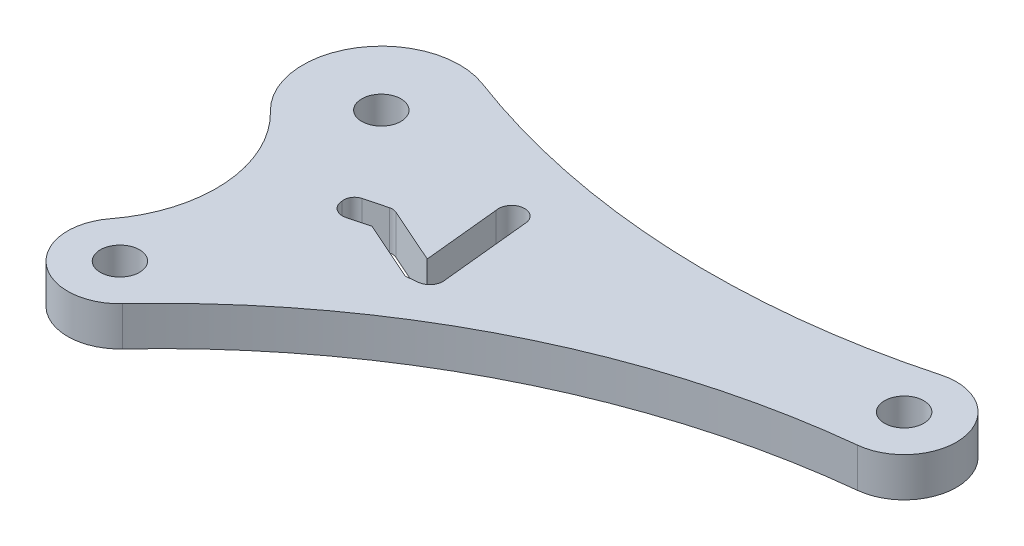
ISO-10303-21;
HEADER;
FILE_DESCRIPTION(('STEP AP214'),'2;1');
FILE_NAME('part.step','',(''),(''),'','','');
FILE_SCHEMA(('AUTOMOTIVE_DESIGN { 1 0 10303 214 1 1 1 1 }'));
ENDSEC;
DATA;
#1=APPLICATION_CONTEXT('core data for automotive mechanical design processes');
#2=APPLICATION_PROTOCOL_DEFINITION('international standard','automotive_design',2000,#1);
#3=PRODUCT_CONTEXT('',#1,'mechanical');
#4=PRODUCT('Part','Part','',(#3));
#5=PRODUCT_RELATED_PRODUCT_CATEGORY('part','',(#4));
#6=PRODUCT_DEFINITION_FORMATION('','',#4);
#7=PRODUCT_DEFINITION_CONTEXT('part definition',#1,'design');
#8=PRODUCT_DEFINITION('design','',#6,#7);
#9=PRODUCT_DEFINITION_SHAPE('','',#8);
#10=(LENGTH_UNIT() NAMED_UNIT(*) SI_UNIT(.MILLI.,.METRE.));
#11=(NAMED_UNIT(*) PLANE_ANGLE_UNIT() SI_UNIT($,.RADIAN.));
#12=(NAMED_UNIT(*) SI_UNIT($,.STERADIAN.) SOLID_ANGLE_UNIT());
#13=UNCERTAINTY_MEASURE_WITH_UNIT(LENGTH_MEASURE(1.E-05),#10,'distance_accuracy_value','');
#14=(GEOMETRIC_REPRESENTATION_CONTEXT(3) GLOBAL_UNCERTAINTY_ASSIGNED_CONTEXT((#13)) GLOBAL_UNIT_ASSIGNED_CONTEXT((#10,
#11,#12)) REPRESENTATION_CONTEXT('',''));
#15=CARTESIAN_POINT('',(0.,0.,0.));
#16=DIRECTION('',(0.,0.,1.));
#17=DIRECTION('',(1.,0.,0.));
#18=AXIS2_PLACEMENT_3D('',#15,#16,#17);
#19=CARTESIAN_POINT('',(41754.3113132953,-442.439495490848,-69.2692277752465));
#20=DIRECTION('',(0.,-1.,0.));
#21=DIRECTION('',(-1.,0.,0.));
#22=AXIS2_PLACEMENT_3D('',#19,#20,#21);
#23=CYLINDRICAL_SURFACE('',#22,59.9999999996444);
#24=CARTESIAN_POINT('',(41754.3113132953,-445.439495490848,-69.2692277752465));
#25=DIRECTION('',(0.,1.,0.));
#26=DIRECTION('',(1.,0.,0.));
#27=AXIS2_PLACEMENT_3D('',#24,#25,#26);
#28=CIRCLE('',#27,59.9999999996444);
#29=CARTESIAN_POINT('',(41733.1749496589,-445.439495490847,-13.1153843432011));
#30=VERTEX_POINT('',#29);
#31=CARTESIAN_POINT('',(41770.0144382952,-445.439495490847,-11.3605767359802));
#32=VERTEX_POINT('',#31);
#33=EDGE_CURVE('E244',#30,#32,#28,.T.);
#34=ORIENTED_EDGE('',*,*,#33,.F.);
#35=DIRECTION('',(0.,-1.,0.));
#36=VECTOR('',#35,1.);
#37=CARTESIAN_POINT('',(41733.1749496589,-442.439495490847,-13.1153843432011));
#38=LINE('',#37,#36);
#39=CARTESIAN_POINT('',(41733.1749496589,-442.439495490847,-13.1153843432011));
#40=VERTEX_POINT('',#39);
#41=EDGE_CURVE('E11',#40,#30,#38,.T.);
#42=ORIENTED_EDGE('',*,*,#41,.F.);
#43=CARTESIAN_POINT('',(41754.3113132953,-442.439495490848,-69.2692277752465));
#44=DIRECTION('',(0.,1.,0.));
#45=DIRECTION('',(1.,0.,0.));
#46=AXIS2_PLACEMENT_3D('',#43,#44,#45);
#47=CIRCLE('',#46,59.9999999996444);
#48=CARTESIAN_POINT('',(41770.0144382952,-442.439495490847,-11.3605767359802));
#49=VERTEX_POINT('',#48);
#50=EDGE_CURVE('E342',#40,#49,#47,.T.);
#51=ORIENTED_EDGE('',*,*,#50,.T.);
#52=DIRECTION('',(0.,-1.,0.));
#53=VECTOR('',#52,1.);
#54=CARTESIAN_POINT('',(41770.0144382952,-442.439495490847,-11.3605767359802));
#55=LINE('',#54,#53);
#56=EDGE_CURVE('E121',#49,#32,#55,.T.);
#57=ORIENTED_EDGE('',*,*,#56,.T.);
#58=EDGE_LOOP('',(#34,#42,#51,#57));
#59=FACE_BOUND('',#58,.T.);
#60=ADVANCED_FACE('F38',(#59),#23,.F.);
#61=CARTESIAN_POINT('',(41731.0613132953,-442.439495490847,-7.49999999996703));
#62=DIRECTION('',(0.,-1.,0.));
#63=DIRECTION('',(-1.,0.,0.));
#64=AXIS2_PLACEMENT_3D('',#61,#62,#63);
#65=CYLINDRICAL_SURFACE('',#64,5.99999999999707);
#66=CARTESIAN_POINT('',(41731.0613132953,-445.439495490847,-7.49999999996703));
#67=DIRECTION('',(0.,1.,0.));
#68=DIRECTION('',(1.,0.,0.));
#69=AXIS2_PLACEMENT_3D('',#66,#67,#68);
#70=CIRCLE('',#69,5.99999999999707);
#71=CARTESIAN_POINT('',(41726.8897016463,-445.439495490847,-3.18749999996526));
#72=VERTEX_POINT('',#71);
#73=EDGE_CURVE('E247',#30,#72,#70,.T.);
#74=ORIENTED_EDGE('',*,*,#73,.T.);
#75=DIRECTION('',(0.,-1.,0.));
#76=VECTOR('',#75,1.);
#77=CARTESIAN_POINT('',(41726.8897016463,-442.439495490847,-3.18749999996526));
#78=LINE('',#77,#76);
#79=CARTESIAN_POINT('',(41726.8897016463,-442.439495490847,-3.18749999996526));
#80=VERTEX_POINT('',#79);
#81=EDGE_CURVE('E48',#80,#72,#78,.T.);
#82=ORIENTED_EDGE('',*,*,#81,.F.);
#83=CARTESIAN_POINT('',(41731.0613132953,-442.439495490847,-7.49999999996703));
#84=DIRECTION('',(0.,1.,0.));
#85=DIRECTION('',(1.,0.,0.));
#86=AXIS2_PLACEMENT_3D('',#83,#84,#85);
#87=CIRCLE('',#86,5.99999999999707);
#88=EDGE_CURVE('E344',#40,#80,#87,.T.);
#89=ORIENTED_EDGE('',*,*,#88,.F.);
#90=ORIENTED_EDGE('',*,*,#41,.T.);
#91=EDGE_LOOP('',(#74,#82,#89,#90));
#92=FACE_BOUND('',#91,.T.);
#93=ADVANCED_FACE('F354',(#92),#65,.T.);
#94=CARTESIAN_POINT('',(41719.9370155646,-442.439495490847,4.00000000003298));
#95=DIRECTION('',(0.,-1.,0.));
#96=DIRECTION('',(-1.,0.,0.));
#97=AXIS2_PLACEMENT_3D('',#94,#95,#96);
#98=CYLINDRICAL_SURFACE('',#97,10.0000000000271);
#99=CARTESIAN_POINT('',(41719.9370155646,-445.439495490847,4.00000000003298));
#100=DIRECTION('',(0.,1.,0.));
#101=DIRECTION('',(1.,0.,0.));
#102=AXIS2_PLACEMENT_3D('',#99,#100,#101);
#103=CIRCLE('',#102,10.0000000000271);
#104=CARTESIAN_POINT('',(41727.8829425151,-445.439495490847,10.0714285714837));
#105=VERTEX_POINT('',#104);
#106=EDGE_CURVE('E250',#105,#72,#103,.T.);
#107=ORIENTED_EDGE('',*,*,#106,.F.);
#108=DIRECTION('',(0.,-1.,0.));
#109=VECTOR('',#108,1.);
#110=CARTESIAN_POINT('',(41727.8829425151,-442.439495490847,10.0714285714837));
#111=LINE('',#110,#109);
#112=CARTESIAN_POINT('',(41727.8829425151,-442.439495490847,10.0714285714837));
#113=VERTEX_POINT('',#112);
#114=EDGE_CURVE('E191',#113,#105,#111,.T.);
#115=ORIENTED_EDGE('',*,*,#114,.F.);
#116=CARTESIAN_POINT('',(41719.9370155646,-442.439495490847,4.00000000003298));
#117=DIRECTION('',(0.,1.,0.));
#118=DIRECTION('',(1.,0.,0.));
#119=AXIS2_PLACEMENT_3D('',#116,#117,#118);
#120=CIRCLE('',#119,10.0000000000271);
#121=EDGE_CURVE('E180',#113,#80,#120,.T.);
#122=ORIENTED_EDGE('',*,*,#121,.T.);
#123=ORIENTED_EDGE('',*,*,#81,.T.);
#124=EDGE_LOOP('',(#107,#115,#122,#123));
#125=FACE_BOUND('',#124,.T.);
#126=ADVANCED_FACE('F347',(#125),#98,.F.);
#127=CARTESIAN_POINT('',(41731.0613132953,-442.439495490847,12.500000000033));
#128=DIRECTION('',(0.,-1.,0.));
#129=DIRECTION('',(-1.,0.,0.));
#130=AXIS2_PLACEMENT_3D('',#127,#128,#129);
#131=CYLINDRICAL_SURFACE('',#130,3.9999999999311);
#132=CARTESIAN_POINT('',(41731.0613132953,-445.439495490847,12.500000000033));
#133=DIRECTION('',(0.,1.,0.));
#134=DIRECTION('',(1.,0.,0.));
#135=AXIS2_PLACEMENT_3D('',#132,#133,#134);
#136=CIRCLE('',#135,3.9999999999311);
#137=CARTESIAN_POINT('',(41733.9874323244,-445.439495490847,15.2272380583682));
#138=VERTEX_POINT('',#137);
#139=EDGE_CURVE('E187',#105,#138,#136,.T.);
#140=ORIENTED_EDGE('',*,*,#139,.T.);
#141=DIRECTION('',(0.,-1.,0.));
#142=VECTOR('',#141,1.);
#143=CARTESIAN_POINT('',(41733.9874323244,-442.439495490847,15.2272380583682));
#144=LINE('',#143,#142);
#145=CARTESIAN_POINT('',(41733.9874323244,-442.439495490847,15.2272380583682));
#146=VERTEX_POINT('',#145);
#147=EDGE_CURVE('E184',#146,#138,#144,.T.);
#148=ORIENTED_EDGE('',*,*,#147,.F.);
#149=CARTESIAN_POINT('',(41731.0613132953,-442.439495490847,12.500000000033));
#150=DIRECTION('',(0.,1.,0.));
#151=DIRECTION('',(1.,0.,0.));
#152=AXIS2_PLACEMENT_3D('',#149,#150,#151);
#153=CIRCLE('',#152,3.9999999999311);
#154=EDGE_CURVE('E173',#113,#146,#153,.T.);
#155=ORIENTED_EDGE('',*,*,#154,.F.);
#156=ORIENTED_EDGE('',*,*,#114,.T.);
#157=EDGE_LOOP('',(#140,#148,#155,#156));
#158=FACE_BOUND('',#157,.T.);
#159=ADVANCED_FACE('F185',(#158),#131,.T.);
#160=CARTESIAN_POINT('',(41777.879217762,-442.439495490847,56.1358089340249));
#161=DIRECTION('',(0.,-1.,0.));
#162=DIRECTION('',(-1.,0.,0.));
#163=AXIS2_PLACEMENT_3D('',#160,#161,#162);
#164=CYLINDRICAL_SURFACE('',#163,59.999999999936);
#165=CARTESIAN_POINT('',(41777.879217762,-445.439495490847,56.1358089340249));
#166=DIRECTION('',(0.,1.,0.));
#167=DIRECTION('',(1.,0.,0.));
#168=AXIS2_PLACEMENT_3D('',#165,#166,#167);
#169=CIRCLE('',#168,59.999999999936);
#170=CARTESIAN_POINT('',(41771.4874323244,-445.439495490847,-3.52276194151807));
#171=VERTEX_POINT('',#170);
#172=EDGE_CURVE('E254',#171,#138,#169,.T.);
#173=ORIENTED_EDGE('',*,*,#172,.F.);
#174=DIRECTION('',(0.,-1.,0.));
#175=VECTOR('',#174,1.);
#176=CARTESIAN_POINT('',(41771.4874323244,-442.439495490847,-3.52276194151807));
#177=LINE('',#176,#175);
#178=CARTESIAN_POINT('',(41771.4874323244,-442.439495490847,-3.52276194151807));
#179=VERTEX_POINT('',#178);
#180=EDGE_CURVE('E114',#179,#171,#177,.T.);
#181=ORIENTED_EDGE('',*,*,#180,.F.);
#182=CARTESIAN_POINT('',(41777.879217762,-442.439495490847,56.1358089340249));
#183=DIRECTION('',(0.,1.,0.));
#184=DIRECTION('',(1.,0.,0.));
#185=AXIS2_PLACEMENT_3D('',#182,#183,#184);
#186=CIRCLE('',#185,59.999999999936);
#187=EDGE_CURVE('E178',#179,#146,#186,.T.);
#188=ORIENTED_EDGE('',*,*,#187,.T.);
#189=ORIENTED_EDGE('',*,*,#147,.T.);
#190=EDGE_LOOP('',(#173,#181,#188,#189));
#191=FACE_BOUND('',#190,.T.);
#192=ADVANCED_FACE('F193',(#191),#164,.F.);
#193=CARTESIAN_POINT('',(41736.5855204021,-442.439495490847,-0.00188107412735228));
#194=DIRECTION('',(0.,-1.,0.));
#195=DIRECTION('',(-1.,0.,0.));
#196=AXIS2_PLACEMENT_3D('',#193,#194,#195);
#197=CYLINDRICAL_SURFACE('',#196,1.00000000012278);
#198=CARTESIAN_POINT('',(41736.5855204021,-445.439495490847,-0.00188107412735228));
#199=DIRECTION('',(0.,1.,0.));
#200=DIRECTION('',(1.,0.,0.));
#201=AXIS2_PLACEMENT_3D('',#198,#199,#200);
#202=CIRCLE('',#201,1.00000000012278);
#203=CARTESIAN_POINT('',(41735.5856998023,-445.439495490847,0.0170601100724643));
#204=VERTEX_POINT('',#203);
#205=CARTESIAN_POINT('',(41736.8388563052,-445.439495490847,0.96549730090284));
#206=VERTEX_POINT('',#205);
#207=EDGE_CURVE('E208',#204,#206,#202,.T.);
#208=ORIENTED_EDGE('',*,*,#207,.F.);
#209=DIRECTION('',(0.,-1.,0.));
#210=VECTOR('',#209,1.);
#211=CARTESIAN_POINT('',(41735.5856998023,-442.439495490847,0.0170601100724643));
#212=LINE('',#211,#210);
#213=CARTESIAN_POINT('',(41735.5856998023,-442.439495490847,0.0170601100724643));
#214=VERTEX_POINT('',#213);
#215=EDGE_CURVE('E42',#214,#204,#212,.T.);
#216=ORIENTED_EDGE('',*,*,#215,.F.);
#217=CARTESIAN_POINT('',(41736.5855204021,-442.439495490847,-0.00188107412735228));
#218=DIRECTION('',(0.,1.,0.));
#219=DIRECTION('',(1.,0.,0.));
#220=AXIS2_PLACEMENT_3D('',#217,#218,#219);
#221=CIRCLE('',#220,1.00000000012278);
#222=CARTESIAN_POINT('',(41736.8388563052,-442.439495490847,0.96549730090284));
#223=VERTEX_POINT('',#222);
#224=EDGE_CURVE('E267',#214,#223,#221,.T.);
#225=ORIENTED_EDGE('',*,*,#224,.T.);
#226=DIRECTION('',(0.,-1.,0.));
#227=VECTOR('',#226,1.);
#228=CARTESIAN_POINT('',(41736.8388563052,-442.439495490847,0.96549730090284));
#229=LINE('',#228,#227);
#230=EDGE_CURVE('E207',#223,#206,#229,.T.);
#231=ORIENTED_EDGE('',*,*,#230,.T.);
#232=EDGE_LOOP('',(#208,#216,#225,#231));
#233=FACE_BOUND('',#232,.T.);
#234=ADVANCED_FACE('F40',(#233),#197,.F.);
#235=CARTESIAN_POINT('',(41736.3707459136,-442.439495490847,-0.1368963881066));
#236=DIRECTION('',(0.,-1.,0.));
#237=DIRECTION('',(-1.,0.,0.));
#238=AXIS2_PLACEMENT_3D('',#235,#236,#237);
#239=CYLINDRICAL_SURFACE('',#238,0.800000000126571);
#240=CARTESIAN_POINT('',(41736.3707459136,-445.439495490847,-0.1368963881066));
#241=DIRECTION('',(0.,1.,0.));
#242=DIRECTION('',(1.,0.,0.));
#243=AXIS2_PLACEMENT_3D('',#240,#241,#242);
#244=CIRCLE('',#243,0.800000000126571);
#245=CARTESIAN_POINT('',(41736.169165633,-445.439495490847,-0.91108331042794));
#246=VERTEX_POINT('',#245);
#247=EDGE_CURVE('E211',#246,#204,#244,.T.);
#248=ORIENTED_EDGE('',*,*,#247,.F.);
#249=DIRECTION('',(0.,-1.,0.));
#250=VECTOR('',#249,1.);
#251=CARTESIAN_POINT('',(41736.169165633,-442.439495490847,-0.91108331042794));
#252=LINE('',#251,#250);
#253=CARTESIAN_POINT('',(41736.169165633,-442.439495490847,-0.91108331042794));
#254=VERTEX_POINT('',#253);
#255=EDGE_CURVE('E290',#254,#246,#252,.T.);
#256=ORIENTED_EDGE('',*,*,#255,.F.);
#257=CARTESIAN_POINT('',(41736.3707459136,-442.439495490847,-0.1368963881066));
#258=DIRECTION('',(0.,1.,0.));
#259=DIRECTION('',(1.,0.,0.));
#260=AXIS2_PLACEMENT_3D('',#257,#258,#259);
#261=CIRCLE('',#260,0.800000000126571);
#262=EDGE_CURVE('E299',#254,#214,#261,.T.);
#263=ORIENTED_EDGE('',*,*,#262,.T.);
#264=ORIENTED_EDGE('',*,*,#215,.T.);
#265=EDGE_LOOP('',(#248,#256,#263,#264));
#266=FACE_BOUND('',#265,.T.);
#267=ADVANCED_FACE('F297',(#266),#239,.F.);
#268=CARTESIAN_POINT('',(2786.70681807326,-442.439495490812,10198.9518087602));
#269=DIRECTION('',(-0.253331808238247,0.,-0.967379447236058));
#270=DIRECTION('',(-0.967379447236058,0.,0.253331808238247));
#271=AXIS2_PLACEMENT_3D('',#268,#269,#270);
#272=PLANE('',#271);
#273=DIRECTION('',(0.967379447236058,0.,-0.253331808238247));
#274=VECTOR('',#273,1.);
#275=CARTESIAN_POINT('',(2786.70681807326,-445.439495490812,10198.9518087602));
#276=LINE('',#275,#274);
#277=CARTESIAN_POINT('',(41737.8316304164,-445.439495490847,-1.34644009921975));
#278=VERTEX_POINT('',#277);
#279=EDGE_CURVE('E214',#246,#278,#276,.T.);
#280=ORIENTED_EDGE('',*,*,#279,.T.);
#281=DIRECTION('',(0.,-1.,0.));
#282=VECTOR('',#281,1.);
#283=CARTESIAN_POINT('',(41737.8316304164,-442.439495490847,-1.34644009921975));
#284=LINE('',#283,#282);
#285=CARTESIAN_POINT('',(41737.8316304164,-442.439495490847,-1.34644009921975));
#286=VERTEX_POINT('',#285);
#287=EDGE_CURVE('E289',#286,#278,#284,.T.);
#288=ORIENTED_EDGE('',*,*,#287,.F.);
#289=DIRECTION('',(0.967379447236058,0.,-0.253331808238247));
#290=VECTOR('',#289,1.);
#291=CARTESIAN_POINT('',(2786.70681807326,-442.439495490812,10198.9518087602));
#292=LINE('',#291,#290);
#293=EDGE_CURVE('E309',#254,#286,#292,.T.);
#294=ORIENTED_EDGE('',*,*,#293,.F.);
#295=ORIENTED_EDGE('',*,*,#255,.T.);
#296=EDGE_LOOP('',(#280,#288,#294,#295));
#297=FACE_BOUND('',#296,.T.);
#298=ADVANCED_FACE('F307',(#297),#272,.F.);
#299=CARTESIAN_POINT('',(41738.0377721111,-442.439495490847,-0.573455234025244));
#300=DIRECTION('',(0.,-1.,0.));
#301=DIRECTION('',(-1.,0.,0.));
#302=AXIS2_PLACEMENT_3D('',#299,#300,#301);
#303=CYLINDRICAL_SURFACE('',#302,0.799999999952325);
#304=CARTESIAN_POINT('',(41738.0377721111,-445.439495490847,-0.573455234025244));
#305=DIRECTION('',(0.,1.,0.));
#306=DIRECTION('',(1.,0.,0.));
#307=AXIS2_PLACEMENT_3D('',#304,#305,#306);
#308=CIRCLE('',#307,0.799999999952325);
#309=CARTESIAN_POINT('',(41738.361410126,-445.439495490847,-1.30506881716802));
#310=VERTEX_POINT('',#309);
#311=EDGE_CURVE('E217',#310,#278,#308,.T.);
#312=ORIENTED_EDGE('',*,*,#311,.F.);
#313=DIRECTION('',(0.,-1.,0.));
#314=VECTOR('',#313,1.);
#315=CARTESIAN_POINT('',(41738.361410126,-442.439495490847,-1.30506881716802));
#316=LINE('',#315,#314);
#317=CARTESIAN_POINT('',(41738.361410126,-442.439495490847,-1.30506881716802));
#318=VERTEX_POINT('',#317);
#319=EDGE_CURVE('E287',#318,#310,#316,.T.);
#320=ORIENTED_EDGE('',*,*,#319,.F.);
#321=CARTESIAN_POINT('',(41738.0377721111,-442.439495490847,-0.573455234025244));
#322=DIRECTION('',(0.,1.,0.));
#323=DIRECTION('',(1.,0.,0.));
#324=AXIS2_PLACEMENT_3D('',#321,#322,#323);
#325=CIRCLE('',#324,0.799999999952325);
#326=EDGE_CURVE('E312',#318,#286,#325,.T.);
#327=ORIENTED_EDGE('',*,*,#326,.T.);
#328=ORIENTED_EDGE('',*,*,#287,.T.);
#329=EDGE_LOOP('',(#312,#320,#327,#328));
#330=FACE_BOUND('',#329,.T.);
#331=ADVANCED_FACE('F313',(#330),#303,.F.);
#332=CARTESIAN_POINT('',(6667.64122732418,-442.439495490902,-15515.2574423597));
#333=DIRECTION('',(-0.40454751941579,0.,0.91451697881151));
#334=DIRECTION('',(0.91451697881151,0.,0.40454751941579));
#335=AXIS2_PLACEMENT_3D('',#332,#333,#334);
#336=PLANE('',#335);
#337=DIRECTION('',(-0.91451697881151,0.,-0.40454751941579));
#338=VECTOR('',#337,1.);
#339=CARTESIAN_POINT('',(6667.64122732418,-445.439495490902,-15515.2574423597));
#340=LINE('',#339,#338);
#341=CARTESIAN_POINT('',(41742.6782334834,-445.439495490847,0.604529606308468));
#342=VERTEX_POINT('',#341);
#343=EDGE_CURVE('E220',#342,#310,#340,.T.);
#344=ORIENTED_EDGE('',*,*,#343,.F.);
#345=DIRECTION('',(0.,-1.,0.));
#346=VECTOR('',#345,1.);
#347=CARTESIAN_POINT('',(41742.6782334834,-442.439495490847,0.604529606308468));
#348=LINE('',#347,#346);
#349=CARTESIAN_POINT('',(41742.6782334834,-442.439495490847,0.604529606308468));
#350=VERTEX_POINT('',#349);
#351=EDGE_CURVE('E285',#350,#342,#348,.T.);
#352=ORIENTED_EDGE('',*,*,#351,.F.);
#353=DIRECTION('',(-0.91451697881151,0.,-0.40454751941579));
#354=VECTOR('',#353,1.);
#355=CARTESIAN_POINT('',(6667.64122732418,-442.439495490902,-15515.2574423597));
#356=LINE('',#355,#354);
#357=EDGE_CURVE('E317',#350,#318,#356,.T.);
#358=ORIENTED_EDGE('',*,*,#357,.T.);
#359=ORIENTED_EDGE('',*,*,#319,.T.);
#360=EDGE_LOOP('',(#344,#352,#358,#359));
#361=FACE_BOUND('',#360,.T.);
#362=ADVANCED_FACE('F394',(#361),#336,.T.);
#363=CARTESIAN_POINT('',(41277.516890478,-442.439495490864,-4608.37428554943));
#364=DIRECTION('',(0.994945648358588,0.,-0.100414923255003));
#365=DIRECTION('',(-0.100414923255003,0.,-0.994945648358589));
#366=AXIS2_PLACEMENT_3D('',#363,#364,#365);
#367=PLANE('',#366);
#368=DIRECTION('',(0.100414923255003,0.,0.994945648358588));
#369=VECTOR('',#368,1.);
#370=CARTESIAN_POINT('',(41277.516890478,-445.439495490864,-4608.37428554943));
#371=LINE('',#370,#369);
#372=CARTESIAN_POINT('',(41742.0857427303,-445.439495490847,-5.26607286328795));
#373=VERTEX_POINT('',#372);
#374=EDGE_CURVE('E223',#373,#342,#371,.T.);
#375=ORIENTED_EDGE('',*,*,#374,.F.);
#376=DIRECTION('',(0.,-1.,0.));
#377=VECTOR('',#376,1.);
#378=CARTESIAN_POINT('',(41742.0857427303,-442.439495490847,-5.26607286328795));
#379=LINE('',#378,#377);
#380=CARTESIAN_POINT('',(41742.0857427303,-442.439495490847,-5.26607286328795));
#381=VERTEX_POINT('',#380);
#382=EDGE_CURVE('E283',#381,#373,#379,.T.);
#383=ORIENTED_EDGE('',*,*,#382,.F.);
#384=DIRECTION('',(0.100414923255003,0.,0.994945648358588));
#385=VECTOR('',#384,1.);
#386=CARTESIAN_POINT('',(41277.516890478,-442.439495490864,-4608.37428554943));
#387=LINE('',#386,#385);
#388=EDGE_CURVE('E319',#381,#350,#387,.T.);
#389=ORIENTED_EDGE('',*,*,#388,.T.);
#390=ORIENTED_EDGE('',*,*,#351,.T.);
#391=EDGE_LOOP('',(#375,#383,#389,#390));
#392=FACE_BOUND('',#391,.T.);
#393=ADVANCED_FACE('F390',(#392),#367,.T.);
#394=CARTESIAN_POINT('',(41743.0655762885,-442.439495490847,-5.46588761903655));
#395=DIRECTION('',(0.,-1.,0.));
#396=DIRECTION('',(-1.,0.,0.));
#397=AXIS2_PLACEMENT_3D('',#394,#395,#396);
#398=CYLINDRICAL_SURFACE('',#397,0.999999869222016);
#399=CARTESIAN_POINT('',(41743.0655762885,-445.439495490847,-5.46588761903655));
#400=DIRECTION('',(0.,1.,0.));
#401=DIRECTION('',(1.,0.,0.));
#402=AXIS2_PLACEMENT_3D('',#399,#400,#401);
#403=CIRCLE('',#402,0.999999869222016);
#404=CARTESIAN_POINT('',(41744.0604371316,-445.439495490847,-5.56714059527036));
#405=VERTEX_POINT('',#404);
#406=EDGE_CURVE('E226',#405,#373,#403,.T.);
#407=ORIENTED_EDGE('',*,*,#406,.F.);
#408=DIRECTION('',(0.,-1.,0.));
#409=VECTOR('',#408,1.);
#410=CARTESIAN_POINT('',(41744.0604371316,-442.439495490847,-5.56714059527036));
#411=LINE('',#410,#409);
#412=CARTESIAN_POINT('',(41744.0604371316,-442.439495490847,-5.56714059527036));
#413=VERTEX_POINT('',#412);
#414=EDGE_CURVE('E281',#413,#405,#411,.T.);
#415=ORIENTED_EDGE('',*,*,#414,.F.);
#416=CARTESIAN_POINT('',(41743.0655762885,-442.439495490847,-5.46588761903655));
#417=DIRECTION('',(0.,1.,0.));
#418=DIRECTION('',(1.,0.,0.));
#419=AXIS2_PLACEMENT_3D('',#416,#417,#418);
#420=CIRCLE('',#419,0.999999869222016);
#421=EDGE_CURVE('E326',#413,#381,#420,.T.);
#422=ORIENTED_EDGE('',*,*,#421,.T.);
#423=ORIENTED_EDGE('',*,*,#382,.T.);
#424=EDGE_LOOP('',(#407,#415,#422,#423));
#425=FACE_BOUND('',#424,.T.);
#426=ADVANCED_FACE('F386',(#425),#398,.F.);
#427=CARTESIAN_POINT('',(41278.4610052592,-442.439495490864,-4613.41584778248));
#428=DIRECTION('',(0.994933730399661,0.,-0.100532940437522));
#429=DIRECTION('',(-0.100532940437522,0.,-0.994933730399661));
#430=AXIS2_PLACEMENT_3D('',#427,#428,#429);
#431=PLANE('',#430);
#432=DIRECTION('',(0.100532940437522,0.,0.994933730399661));
#433=VECTOR('',#432,1.);
#434=CARTESIAN_POINT('',(41278.4610052592,-445.439495490864,-4613.41584778248));
#435=LINE('',#434,#433);
#436=CARTESIAN_POINT('',(41744.7541334155,-445.439495490847,1.29809012896537));
#437=VERTEX_POINT('',#436);
#438=EDGE_CURVE('E229',#405,#437,#435,.T.);
#439=ORIENTED_EDGE('',*,*,#438,.T.);
#440=DIRECTION('',(0.,-1.,0.));
#441=VECTOR('',#440,1.);
#442=CARTESIAN_POINT('',(41744.7541334155,-442.439495490847,1.29809012896537));
#443=LINE('',#442,#441);
#444=CARTESIAN_POINT('',(41744.7541334155,-442.439495490847,1.29809012896537));
#445=VERTEX_POINT('',#444);
#446=EDGE_CURVE('E279',#445,#437,#443,.T.);
#447=ORIENTED_EDGE('',*,*,#446,.F.);
#448=DIRECTION('',(0.100532940437522,0.,0.994933730399661));
#449=VECTOR('',#448,1.);
#450=CARTESIAN_POINT('',(41278.4610052592,-442.439495490864,-4613.41584778248));
#451=LINE('',#450,#449);
#452=EDGE_CURVE('E329',#413,#445,#451,.T.);
#453=ORIENTED_EDGE('',*,*,#452,.F.);
#454=ORIENTED_EDGE('',*,*,#414,.T.);
#455=EDGE_LOOP('',(#439,#447,#453,#454));
#456=FACE_BOUND('',#455,.T.);
#457=ADVANCED_FACE('F382',(#456),#431,.F.);
#458=CARTESIAN_POINT('',(41743.7743471595,-442.439495490847,1.49813735581505));
#459=DIRECTION('',(0.,-1.,0.));
#460=DIRECTION('',(-1.,0.,0.));
#461=AXIS2_PLACEMENT_3D('',#458,#459,#460);
#462=CYLINDRICAL_SURFACE('',#461,1.00000000014001);
#463=CARTESIAN_POINT('',(41743.7743471595,-445.439495490847,1.49813735581505));
#464=DIRECTION('',(0.,1.,0.));
#465=DIRECTION('',(1.,0.,0.));
#466=AXIS2_PLACEMENT_3D('',#463,#464,#465);
#467=CIRCLE('',#466,1.00000000014001);
#468=CARTESIAN_POINT('',(41743.8756001224,-445.439495490847,2.49299806857578));
#469=VERTEX_POINT('',#468);
#470=EDGE_CURVE('E232',#469,#437,#467,.T.);
#471=ORIENTED_EDGE('',*,*,#470,.F.);
#472=DIRECTION('',(0.,-1.,0.));
#473=VECTOR('',#472,1.);
#474=CARTESIAN_POINT('',(41743.8756001224,-442.439495490847,2.49299806857578));
#475=LINE('',#474,#473);
#476=CARTESIAN_POINT('',(41743.8756001224,-442.439495490847,2.49299806857578));
#477=VERTEX_POINT('',#476);
#478=EDGE_CURVE('E277',#477,#469,#475,.T.);
#479=ORIENTED_EDGE('',*,*,#478,.F.);
#480=CARTESIAN_POINT('',(41743.7743471595,-442.439495490847,1.49813735581505));
#481=DIRECTION('',(0.,1.,0.));
#482=DIRECTION('',(1.,0.,0.));
#483=AXIS2_PLACEMENT_3D('',#480,#481,#482);
#484=CIRCLE('',#483,1.00000000014001);
#485=EDGE_CURVE('E331',#477,#445,#484,.T.);
#486=ORIENTED_EDGE('',*,*,#485,.T.);
#487=ORIENTED_EDGE('',*,*,#446,.T.);
#488=EDGE_LOOP('',(#471,#479,#486,#487));
#489=FACE_BOUND('',#488,.T.);
#490=ADVANCED_FACE('F378',(#489),#462,.F.);
#491=CARTESIAN_POINT('',(472.784201796027,-442.439495490833,4202.9003912389));
#492=DIRECTION('',(-0.101252963049734,0.,-0.994860712599331));
#493=DIRECTION('',(-0.994860712599331,0.,0.101252963049734));
#494=AXIS2_PLACEMENT_3D('',#491,#492,#493);
#495=PLANE('',#494);
#496=DIRECTION('',(0.994860712599331,0.,-0.101252963049734));
#497=VECTOR('',#496,1.);
#498=CARTESIAN_POINT('',(472.784201796027,-445.439495490833,4202.9003912389));
#499=LINE('',#498,#497);
#500=CARTESIAN_POINT('',(41742.9802254806,-445.439495490847,2.58412573536521));
#501=VERTEX_POINT('',#500);
#502=EDGE_CURVE('E235',#501,#469,#499,.T.);
#503=ORIENTED_EDGE('',*,*,#502,.F.);
#504=DIRECTION('',(0.,-1.,0.));
#505=VECTOR('',#504,1.);
#506=CARTESIAN_POINT('',(41742.9802254806,-442.439495490847,2.58412573536521));
#507=LINE('',#506,#505);
#508=CARTESIAN_POINT('',(41742.9802254806,-442.439495490847,2.58412573536521));
#509=VERTEX_POINT('',#508);
#510=EDGE_CURVE('E275',#509,#501,#507,.T.);
#511=ORIENTED_EDGE('',*,*,#510,.F.);
#512=DIRECTION('',(0.994860712599331,0.,-0.101252963049734));
#513=VECTOR('',#512,1.);
#514=CARTESIAN_POINT('',(472.784201796027,-442.439495490833,4202.9003912389));
#515=LINE('',#514,#513);
#516=EDGE_CURVE('E334',#509,#477,#515,.T.);
#517=ORIENTED_EDGE('',*,*,#516,.T.);
#518=ORIENTED_EDGE('',*,*,#478,.T.);
#519=EDGE_LOOP('',(#503,#511,#517,#518));
#520=FACE_BOUND('',#519,.T.);
#521=ADVANCED_FACE('F374',(#520),#495,.T.);
#522=CARTESIAN_POINT('',(6717.92944800602,-442.439495490902,-15560.8967397245));
#523=DIRECTION('',(0.406068562764917,0.,-0.913842613546794));
#524=DIRECTION('',(-0.913842613546794,0.,-0.406068562764917));
#525=AXIS2_PLACEMENT_3D('',#522,#523,#524);
#526=PLANE('',#525);
#527=DIRECTION('',(0.913842613546794,0.,0.406068562764917));
#528=VECTOR('',#527,1.);
#529=CARTESIAN_POINT('',(6717.92944800602,-445.439495490902,-15560.8967397245));
#530=LINE('',#529,#528);
#531=CARTESIAN_POINT('',(41738.4110124135,-445.439495490847,0.553782921789037));
#532=VERTEX_POINT('',#531);
#533=EDGE_CURVE('E238',#532,#501,#530,.T.);
#534=ORIENTED_EDGE('',*,*,#533,.F.);
#535=DIRECTION('',(0.,-1.,0.));
#536=VECTOR('',#535,1.);
#537=CARTESIAN_POINT('',(41738.4110124135,-442.439495490847,0.553782921789037));
#538=LINE('',#537,#536);
#539=CARTESIAN_POINT('',(41738.4110124135,-442.439495490847,0.553782921789037));
#540=VERTEX_POINT('',#539);
#541=EDGE_CURVE('E273',#540,#532,#538,.T.);
#542=ORIENTED_EDGE('',*,*,#541,.F.);
#543=DIRECTION('',(0.913842613546794,0.,0.406068562764917));
#544=VECTOR('',#543,1.);
#545=CARTESIAN_POINT('',(6717.92944800602,-442.439495490902,-15560.8967397245));
#546=LINE('',#545,#544);
#547=EDGE_CURVE('E337',#540,#509,#546,.T.);
#548=ORIENTED_EDGE('',*,*,#547,.T.);
#549=ORIENTED_EDGE('',*,*,#510,.T.);
#550=EDGE_LOOP('',(#534,#542,#548,#549));
#551=FACE_BOUND('',#550,.T.);
#552=ADVANCED_FACE('F370',(#551),#526,.T.);
#553=CARTESIAN_POINT('',(41731.0613132953,-442.439495490847,-7.49999999996703));
#554=DIRECTION('',(0.,-1.,0.));
#555=DIRECTION('',(-1.,0.,0.));
#556=AXIS2_PLACEMENT_3D('',#553,#554,#555);
#557=CYLINDRICAL_SURFACE('',#556,1.50000000000178);
#558=CARTESIAN_POINT('',(41731.0613132953,-442.439495490847,-7.49999999996703));
#559=DIRECTION('',(0.,1.,0.));
#560=DIRECTION('',(1.,0.,0.));
#561=AXIS2_PLACEMENT_3D('',#558,#559,#560);
#562=CIRCLE('',#561,1.50000000000178);
#563=CARTESIAN_POINT('',(41732.5613132953,-442.439495490847,-7.49999999996703));
#564=VERTEX_POINT('',#563);
#565=EDGE_CURVE('E201',#564,#564,#562,.T.);
#566=ORIENTED_EDGE('',*,*,#565,.T.);
#567=EDGE_LOOP('',(#566));
#568=FACE_BOUND('',#567,.T.);
#569=CARTESIAN_POINT('',(41731.0613132953,-445.439495490847,-7.49999999996703));
#570=DIRECTION('',(0.,1.,0.));
#571=DIRECTION('',(1.,0.,0.));
#572=AXIS2_PLACEMENT_3D('',#569,#570,#571);
#573=CIRCLE('',#572,1.50000000000178);
#574=CARTESIAN_POINT('',(41732.5613132953,-445.439495490847,-7.49999999996703));
#575=VERTEX_POINT('',#574);
#576=EDGE_CURVE('E261',#575,#575,#573,.T.);
#577=ORIENTED_EDGE('',*,*,#576,.F.);
#578=EDGE_LOOP('',(#577));
#579=FACE_BOUND('',#578,.T.);
#580=ADVANCED_FACE('F373',(#568,#579),#557,.F.);
#581=CARTESIAN_POINT('',(41771.0613132953,-442.439495490847,-7.49999999996703));
#582=DIRECTION('',(0.,-1.,0.));
#583=DIRECTION('',(-1.,0.,0.));
#584=AXIS2_PLACEMENT_3D('',#581,#582,#583);
#585=CYLINDRICAL_SURFACE('',#584,1.50000000000178);
#586=CARTESIAN_POINT('',(41771.0613132953,-442.439495490847,-7.49999999996703));
#587=DIRECTION('',(0.,1.,0.));
#588=DIRECTION('',(1.,0.,0.));
#589=AXIS2_PLACEMENT_3D('',#586,#587,#588);
#590=CIRCLE('',#589,1.50000000000178);
#591=CARTESIAN_POINT('',(41772.5613132953,-442.439495490847,-7.49999999996703));
#592=VERTEX_POINT('',#591);
#593=EDGE_CURVE('E195',#592,#592,#590,.T.);
#594=ORIENTED_EDGE('',*,*,#593,.T.);
#595=EDGE_LOOP('',(#594));
#596=FACE_BOUND('',#595,.T.);
#597=CARTESIAN_POINT('',(41771.0613132953,-445.439495490847,-7.49999999996703));
#598=DIRECTION('',(0.,1.,0.));
#599=DIRECTION('',(1.,0.,0.));
#600=AXIS2_PLACEMENT_3D('',#597,#598,#599);
#601=CIRCLE('',#600,1.50000000000178);
#602=CARTESIAN_POINT('',(41772.5613132953,-445.439495490847,-7.49999999996703));
#603=VERTEX_POINT('',#602);
#604=EDGE_CURVE('E258',#603,#603,#601,.T.);
#605=ORIENTED_EDGE('',*,*,#604,.F.);
#606=EDGE_LOOP('',(#605));
#607=FACE_BOUND('',#606,.T.);
#608=ADVANCED_FACE('F416',(#596,#607),#585,.F.);
#609=CARTESIAN_POINT('',(41771.0613132953,-442.439495490847,-7.49999999996703));
#610=DIRECTION('',(0.,-1.,0.));
#611=DIRECTION('',(-1.,0.,0.));
#612=AXIS2_PLACEMENT_3D('',#609,#610,#611);
#613=CYLINDRICAL_SURFACE('',#612,4.0000000000376);
#614=CARTESIAN_POINT('',(41771.0613132953,-445.439495490847,-7.49999999996703));
#615=DIRECTION('',(0.,1.,0.));
#616=DIRECTION('',(1.,0.,0.));
#617=AXIS2_PLACEMENT_3D('',#614,#615,#616);
#618=CIRCLE('',#617,4.0000000000376);
#619=EDGE_CURVE('E256',#171,#32,#618,.T.);
#620=ORIENTED_EDGE('',*,*,#619,.T.);
#621=ORIENTED_EDGE('',*,*,#56,.F.);
#622=CARTESIAN_POINT('',(41771.0613132953,-442.439495490847,-7.49999999996703));
#623=DIRECTION('',(0.,1.,0.));
#624=DIRECTION('',(1.,0.,0.));
#625=AXIS2_PLACEMENT_3D('',#622,#623,#624);
#626=CIRCLE('',#625,4.0000000000376);
#627=EDGE_CURVE('E57',#179,#49,#626,.T.);
#628=ORIENTED_EDGE('',*,*,#627,.F.);
#629=ORIENTED_EDGE('',*,*,#180,.T.);
#630=EDGE_LOOP('',(#620,#621,#628,#629));
#631=FACE_BOUND('',#630,.T.);
#632=ADVANCED_FACE('F351',(#631),#613,.T.);
#633=CARTESIAN_POINT('',(2787.29790897134,-442.439495490812,10201.0251376459));
#634=DIRECTION('',(0.253335902797555,0.,0.967378374966976));
#635=DIRECTION('',(0.967378374966976,0.,-0.253335902797556));
#636=AXIS2_PLACEMENT_3D('',#633,#634,#635);
#637=PLANE('',#636);
#638=DIRECTION('',(-0.967378374966976,0.,0.253335902797556));
#639=VECTOR('',#638,1.);
#640=CARTESIAN_POINT('',(2787.29790897134,-445.439495490812,10201.0251376459));
#641=LINE('',#640,#639);
#642=EDGE_CURVE('E241',#532,#206,#641,.T.);
#643=ORIENTED_EDGE('',*,*,#642,.T.);
#644=ORIENTED_EDGE('',*,*,#230,.F.);
#645=DIRECTION('',(-0.967378374966976,0.,0.253335902797556));
#646=VECTOR('',#645,1.);
#647=CARTESIAN_POINT('',(2787.29790897134,-442.439495490812,10201.0251376459));
#648=LINE('',#647,#646);
#649=EDGE_CURVE('E340',#540,#223,#648,.T.);
#650=ORIENTED_EDGE('',*,*,#649,.F.);
#651=ORIENTED_EDGE('',*,*,#541,.T.);
#652=EDGE_LOOP('',(#643,#644,#650,#651));
#653=FACE_BOUND('',#652,.T.);
#654=ADVANCED_FACE('F365',(#653),#637,.F.);
#655=CARTESIAN_POINT('',(41731.0613132953,-442.439495490847,12.500000000033));
#656=DIRECTION('',(0.,-1.,0.));
#657=DIRECTION('',(-1.,0.,0.));
#658=AXIS2_PLACEMENT_3D('',#655,#656,#657);
#659=CYLINDRICAL_SURFACE('',#658,1.50000000000178);
#660=CARTESIAN_POINT('',(41731.0613132953,-442.439495490847,12.500000000033));
#661=DIRECTION('',(0.,1.,0.));
#662=DIRECTION('',(1.,0.,0.));
#663=AXIS2_PLACEMENT_3D('',#660,#661,#662);
#664=CIRCLE('',#663,1.50000000000178);
#665=CARTESIAN_POINT('',(41732.5613132953,-442.439495490847,12.500000000033));
#666=VERTEX_POINT('',#665);
#667=EDGE_CURVE('E204',#666,#666,#664,.T.);
#668=ORIENTED_EDGE('',*,*,#667,.T.);
#669=EDGE_LOOP('',(#668));
#670=FACE_BOUND('',#669,.T.);
#671=CARTESIAN_POINT('',(41731.0613132953,-445.439495490847,12.500000000033));
#672=DIRECTION('',(0.,1.,0.));
#673=DIRECTION('',(1.,0.,0.));
#674=AXIS2_PLACEMENT_3D('',#671,#672,#673);
#675=CIRCLE('',#674,1.50000000000178);
#676=CARTESIAN_POINT('',(41732.5613132953,-445.439495490847,12.500000000033));
#677=VERTEX_POINT('',#676);
#678=EDGE_CURVE('E264',#677,#677,#675,.T.);
#679=ORIENTED_EDGE('',*,*,#678,.F.);
#680=EDGE_LOOP('',(#679));
#681=FACE_BOUND('',#680,.T.);
#682=ADVANCED_FACE('F368',(#670,#681),#659,.F.);
#683=CARTESIAN_POINT('',(0.,-442.439495490849,-442.439495490847));
#684=DIRECTION('',(0.,1.,0.));
#685=DIRECTION('',(1.,0.,0.));
#686=AXIS2_PLACEMENT_3D('',#683,#684,#685);
#687=PLANE('',#686);
#688=ORIENTED_EDGE('',*,*,#224,.F.);
#689=ORIENTED_EDGE('',*,*,#262,.F.);
#690=ORIENTED_EDGE('',*,*,#293,.T.);
#691=ORIENTED_EDGE('',*,*,#326,.F.);
#692=ORIENTED_EDGE('',*,*,#357,.F.);
#693=ORIENTED_EDGE('',*,*,#388,.F.);
#694=ORIENTED_EDGE('',*,*,#421,.F.);
#695=ORIENTED_EDGE('',*,*,#452,.T.);
#696=ORIENTED_EDGE('',*,*,#485,.F.);
#697=ORIENTED_EDGE('',*,*,#516,.F.);
#698=ORIENTED_EDGE('',*,*,#547,.F.);
#699=ORIENTED_EDGE('',*,*,#649,.T.);
#700=EDGE_LOOP('',(#688,#689,#690,#691,#692,#693,#694,#695,#696,#697,#698,#699));
#701=FACE_BOUND('',#700,.T.);
#702=ORIENTED_EDGE('',*,*,#50,.F.);
#703=ORIENTED_EDGE('',*,*,#88,.T.);
#704=ORIENTED_EDGE('',*,*,#121,.F.);
#705=ORIENTED_EDGE('',*,*,#154,.T.);
#706=ORIENTED_EDGE('',*,*,#187,.F.);
#707=ORIENTED_EDGE('',*,*,#627,.T.);
#708=EDGE_LOOP('',(#702,#703,#704,#705,#706,#707));
#709=FACE_BOUND('',#708,.T.);
#710=ORIENTED_EDGE('',*,*,#593,.F.);
#711=EDGE_LOOP('',(#710));
#712=FACE_BOUND('',#711,.T.);
#713=ORIENTED_EDGE('',*,*,#565,.F.);
#714=EDGE_LOOP('',(#713));
#715=FACE_BOUND('',#714,.T.);
#716=ORIENTED_EDGE('',*,*,#667,.F.);
#717=EDGE_LOOP('',(#716));
#718=FACE_BOUND('',#717,.T.);
#719=ADVANCED_FACE('F175',(#701,#709,#712,#715,#718),#687,.T.);
#720=CARTESIAN_POINT('',(0.,-445.439495490849,-442.439495490847));
#721=DIRECTION('',(0.,1.,0.));
#722=DIRECTION('',(1.,0.,0.));
#723=AXIS2_PLACEMENT_3D('',#720,#721,#722);
#724=PLANE('',#723);
#725=ORIENTED_EDGE('',*,*,#207,.T.);
#726=ORIENTED_EDGE('',*,*,#642,.F.);
#727=ORIENTED_EDGE('',*,*,#533,.T.);
#728=ORIENTED_EDGE('',*,*,#502,.T.);
#729=ORIENTED_EDGE('',*,*,#470,.T.);
#730=ORIENTED_EDGE('',*,*,#438,.F.);
#731=ORIENTED_EDGE('',*,*,#406,.T.);
#732=ORIENTED_EDGE('',*,*,#374,.T.);
#733=ORIENTED_EDGE('',*,*,#343,.T.);
#734=ORIENTED_EDGE('',*,*,#311,.T.);
#735=ORIENTED_EDGE('',*,*,#279,.F.);
#736=ORIENTED_EDGE('',*,*,#247,.T.);
#737=EDGE_LOOP('',(#725,#726,#727,#728,#729,#730,#731,#732,#733,#734,#735,#736));
#738=FACE_BOUND('',#737,.T.);
#739=ORIENTED_EDGE('',*,*,#33,.T.);
#740=ORIENTED_EDGE('',*,*,#619,.F.);
#741=ORIENTED_EDGE('',*,*,#172,.T.);
#742=ORIENTED_EDGE('',*,*,#139,.F.);
#743=ORIENTED_EDGE('',*,*,#106,.T.);
#744=ORIENTED_EDGE('',*,*,#73,.F.);
#745=EDGE_LOOP('',(#739,#740,#741,#742,#743,#744));
#746=FACE_BOUND('',#745,.T.);
#747=ORIENTED_EDGE('',*,*,#604,.T.);
#748=EDGE_LOOP('',(#747));
#749=FACE_BOUND('',#748,.T.);
#750=ORIENTED_EDGE('',*,*,#576,.T.);
#751=EDGE_LOOP('',(#750));
#752=FACE_BOUND('',#751,.T.);
#753=ORIENTED_EDGE('',*,*,#678,.T.);
#754=EDGE_LOOP('',(#753));
#755=FACE_BOUND('',#754,.T.);
#756=ADVANCED_FACE('F303',(#738,#746,#749,#752,#755),#724,.F.);
#757=CLOSED_SHELL('',(#60,#93,#126,#159,#192,#234,#267,#298,#331,#362,#393,#426,#457,#490,#521,
#552,#580,#608,#632,#654,#682,#719,#756));
#758=MANIFOLD_SOLID_BREP('B2',#757);
#759=ADVANCED_BREP_SHAPE_REPRESENTATION('',(#18,#758),#14);
#760=SHAPE_DEFINITION_REPRESENTATION(#9,#759);
ENDSEC;
END-ISO-10303-21;
